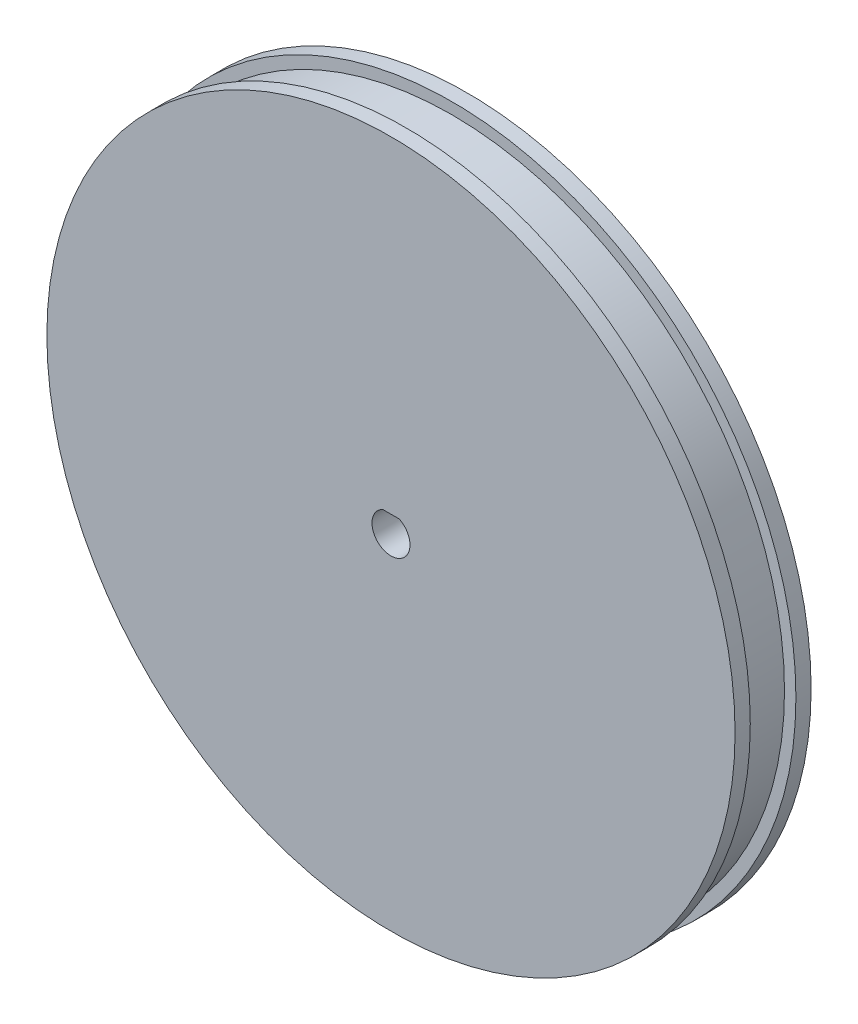
ISO-10303-21;
HEADER;
FILE_DESCRIPTION(('STEP AP214'),'2;1');
FILE_NAME('part.step','',(''),(''),'','','');
FILE_SCHEMA(('AUTOMOTIVE_DESIGN { 1 0 10303 214 1 1 1 1 }'));
ENDSEC;
DATA;
#1=APPLICATION_CONTEXT('core data for automotive mechanical design processes');
#2=APPLICATION_PROTOCOL_DEFINITION('international standard','automotive_design',2000,#1);
#3=PRODUCT_CONTEXT('',#1,'mechanical');
#4=PRODUCT('Part','Part','',(#3));
#5=PRODUCT_RELATED_PRODUCT_CATEGORY('part','',(#4));
#6=PRODUCT_DEFINITION_FORMATION('','',#4);
#7=PRODUCT_DEFINITION_CONTEXT('part definition',#1,'design');
#8=PRODUCT_DEFINITION('design','',#6,#7);
#9=PRODUCT_DEFINITION_SHAPE('','',#8);
#10=(LENGTH_UNIT() NAMED_UNIT(*) SI_UNIT(.MILLI.,.METRE.));
#11=(NAMED_UNIT(*) PLANE_ANGLE_UNIT() SI_UNIT($,.RADIAN.));
#12=(NAMED_UNIT(*) SI_UNIT($,.STERADIAN.) SOLID_ANGLE_UNIT());
#13=UNCERTAINTY_MEASURE_WITH_UNIT(LENGTH_MEASURE(1.E-05),#10,'distance_accuracy_value','');
#14=(GEOMETRIC_REPRESENTATION_CONTEXT(3) GLOBAL_UNCERTAINTY_ASSIGNED_CONTEXT((#13)) GLOBAL_UNIT_ASSIGNED_CONTEXT((#10,
#11,#12)) REPRESENTATION_CONTEXT('',''));
#15=CARTESIAN_POINT('',(0.,0.,0.));
#16=DIRECTION('',(0.,0.,1.));
#17=DIRECTION('',(1.,0.,0.));
#18=AXIS2_PLACEMENT_3D('',#15,#16,#17);
#19=CARTESIAN_POINT('',(0.,0.,6.));
#20=DIRECTION('',(0.,0.,-1.));
#21=DIRECTION('',(-1.,0.,0.));
#22=AXIS2_PLACEMENT_3D('',#19,#20,#21);
#23=CYLINDRICAL_SURFACE('',#22,43.75);
#24=CARTESIAN_POINT('',(0.,0.,6.));
#25=DIRECTION('',(0.,0.,1.));
#26=DIRECTION('',(1.,0.,0.));
#27=AXIS2_PLACEMENT_3D('',#24,#25,#26);
#28=CIRCLE('',#27,43.75);
#29=CARTESIAN_POINT('',(43.75,0.,6.));
#30=VERTEX_POINT('',#29);
#31=EDGE_CURVE('E11',#30,#30,#28,.T.);
#32=ORIENTED_EDGE('',*,*,#31,.F.);
#33=EDGE_LOOP('',(#32));
#34=FACE_BOUND('',#33,.T.);
#35=CARTESIAN_POINT('',(0.,0.,0.));
#36=DIRECTION('',(0.,0.,1.));
#37=DIRECTION('',(1.,0.,0.));
#38=AXIS2_PLACEMENT_3D('',#35,#36,#37);
#39=CIRCLE('',#38,43.75);
#40=CARTESIAN_POINT('',(43.75,0.,0.));
#41=VERTEX_POINT('',#40);
#42=EDGE_CURVE('E41',#41,#41,#39,.T.);
#43=ORIENTED_EDGE('',*,*,#42,.T.);
#44=EDGE_LOOP('',(#43));
#45=FACE_BOUND('',#44,.T.);
#46=ADVANCED_FACE('F38',(#34,#45),#23,.T.);
#47=CARTESIAN_POINT('',(0.,0.,-2.));
#48=DIRECTION('',(0.,0.,1.));
#49=DIRECTION('',(1.,0.,0.));
#50=AXIS2_PLACEMENT_3D('',#47,#48,#49);
#51=CYLINDRICAL_SURFACE('',#50,45.25);
#52=CARTESIAN_POINT('',(0.,0.,-2.));
#53=DIRECTION('',(0.,0.,-1.));
#54=DIRECTION('',(-1.,0.,0.));
#55=AXIS2_PLACEMENT_3D('',#52,#53,#54);
#56=CIRCLE('',#55,45.25);
#57=CARTESIAN_POINT('',(-45.25,0.,-2.));
#58=VERTEX_POINT('',#57);
#59=EDGE_CURVE('E93',#58,#58,#56,.T.);
#60=ORIENTED_EDGE('',*,*,#59,.F.);
#61=EDGE_LOOP('',(#60));
#62=FACE_BOUND('',#61,.T.);
#63=CARTESIAN_POINT('',(0.,0.,0.));
#64=DIRECTION('',(0.,0.,-1.));
#65=DIRECTION('',(-1.,0.,0.));
#66=AXIS2_PLACEMENT_3D('',#63,#64,#65);
#67=CIRCLE('',#66,45.25);
#68=CARTESIAN_POINT('',(-45.25,0.,0.));
#69=VERTEX_POINT('',#68);
#70=EDGE_CURVE('E89',#69,#69,#67,.T.);
#71=ORIENTED_EDGE('',*,*,#70,.T.);
#72=EDGE_LOOP('',(#71));
#73=FACE_BOUND('',#72,.T.);
#74=ADVANCED_FACE('F102',(#62,#73),#51,.T.);
#75=CARTESIAN_POINT('',(0.,0.,-2.));
#76=DIRECTION('',(0.,0.,-1.));
#77=DIRECTION('',(-1.,0.,0.));
#78=AXIS2_PLACEMENT_3D('',#75,#76,#77);
#79=PLANE('',#78);
#80=CARTESIAN_POINT('',(0.,0.,-2.));
#81=DIRECTION('',(0.,0.,1.));
#82=DIRECTION('',(1.,0.,0.));
#83=AXIS2_PLACEMENT_3D('',#80,#81,#82);
#84=CIRCLE('',#83,2.5);
#85=CARTESIAN_POINT('',(-1.08972473588517,2.25,-2.));
#86=VERTEX_POINT('',#85);
#87=CARTESIAN_POINT('',(1.08972473588517,2.25,-2.));
#88=VERTEX_POINT('',#87);
#89=EDGE_CURVE('E53',#86,#88,#84,.T.);
#90=ORIENTED_EDGE('',*,*,#89,.T.);
#91=DIRECTION('',(-1.,0.,0.));
#92=VECTOR('',#91,1.);
#93=CARTESIAN_POINT('',(-1.08972473588517,2.25,-2.));
#94=LINE('',#93,#92);
#95=EDGE_CURVE('E81',#88,#86,#94,.T.);
#96=ORIENTED_EDGE('',*,*,#95,.T.);
#97=EDGE_LOOP('',(#90,#96));
#98=FACE_BOUND('',#97,.T.);
#99=ORIENTED_EDGE('',*,*,#59,.T.);
#100=EDGE_LOOP('',(#99));
#101=FACE_BOUND('',#100,.T.);
#102=ADVANCED_FACE('F107',(#98,#101),#79,.T.);
#103=CARTESIAN_POINT('',(0.,0.,0.));
#104=DIRECTION('',(0.,0.,-1.));
#105=DIRECTION('',(-1.,0.,0.));
#106=AXIS2_PLACEMENT_3D('',#103,#104,#105);
#107=PLANE('',#106);
#108=ORIENTED_EDGE('',*,*,#42,.F.);
#109=EDGE_LOOP('',(#108));
#110=FACE_BOUND('',#109,.T.);
#111=ORIENTED_EDGE('',*,*,#70,.F.);
#112=EDGE_LOOP('',(#111));
#113=FACE_BOUND('',#112,.T.);
#114=ADVANCED_FACE('F104',(#110,#113),#107,.F.);
#115=CARTESIAN_POINT('',(0.,0.,8.));
#116=DIRECTION('',(0.,0.,-1.));
#117=DIRECTION('',(-1.,0.,0.));
#118=AXIS2_PLACEMENT_3D('',#115,#116,#117);
#119=CYLINDRICAL_SURFACE('',#118,45.25);
#120=CARTESIAN_POINT('',(0.,0.,8.));
#121=DIRECTION('',(0.,0.,1.));
#122=DIRECTION('',(1.,0.,0.));
#123=AXIS2_PLACEMENT_3D('',#120,#121,#122);
#124=CIRCLE('',#123,45.25);
#125=CARTESIAN_POINT('',(45.25,0.,8.));
#126=VERTEX_POINT('',#125);
#127=EDGE_CURVE('E85',#126,#126,#124,.T.);
#128=ORIENTED_EDGE('',*,*,#127,.F.);
#129=EDGE_LOOP('',(#128));
#130=FACE_BOUND('',#129,.T.);
#131=CARTESIAN_POINT('',(0.,0.,6.));
#132=DIRECTION('',(0.,0.,1.));
#133=DIRECTION('',(1.,0.,0.));
#134=AXIS2_PLACEMENT_3D('',#131,#132,#133);
#135=CIRCLE('',#134,45.25);
#136=CARTESIAN_POINT('',(45.25,0.,6.));
#137=VERTEX_POINT('',#136);
#138=EDGE_CURVE('E69',#137,#137,#135,.T.);
#139=ORIENTED_EDGE('',*,*,#138,.T.);
#140=EDGE_LOOP('',(#139));
#141=FACE_BOUND('',#140,.T.);
#142=ADVANCED_FACE('F106',(#130,#141),#119,.T.);
#143=CARTESIAN_POINT('',(0.,0.,8.));
#144=DIRECTION('',(0.,0.,1.));
#145=DIRECTION('',(1.,0.,0.));
#146=AXIS2_PLACEMENT_3D('',#143,#144,#145);
#147=PLANE('',#146);
#148=CARTESIAN_POINT('',(0.,0.,8.));
#149=DIRECTION('',(0.,0.,1.));
#150=DIRECTION('',(1.,0.,0.));
#151=AXIS2_PLACEMENT_3D('',#148,#149,#150);
#152=CIRCLE('',#151,2.5);
#153=CARTESIAN_POINT('',(-1.08972473588517,2.25,8.));
#154=VERTEX_POINT('',#153);
#155=CARTESIAN_POINT('',(1.08972473588517,2.25,8.));
#156=VERTEX_POINT('',#155);
#157=EDGE_CURVE('E58',#154,#156,#152,.T.);
#158=ORIENTED_EDGE('',*,*,#157,.F.);
#159=DIRECTION('',(-1.,0.,0.));
#160=VECTOR('',#159,1.);
#161=CARTESIAN_POINT('',(-1.08972473588517,2.25,8.));
#162=LINE('',#161,#160);
#163=EDGE_CURVE('E73',#156,#154,#162,.T.);
#164=ORIENTED_EDGE('',*,*,#163,.F.);
#165=EDGE_LOOP('',(#158,#164));
#166=FACE_BOUND('',#165,.T.);
#167=ORIENTED_EDGE('',*,*,#127,.T.);
#168=EDGE_LOOP('',(#167));
#169=FACE_BOUND('',#168,.T.);
#170=ADVANCED_FACE('F77',(#166,#169),#147,.T.);
#171=CARTESIAN_POINT('',(0.,0.,6.));
#172=DIRECTION('',(0.,0.,1.));
#173=DIRECTION('',(1.,0.,0.));
#174=AXIS2_PLACEMENT_3D('',#171,#172,#173);
#175=PLANE('',#174);
#176=ORIENTED_EDGE('',*,*,#31,.T.);
#177=EDGE_LOOP('',(#176));
#178=FACE_BOUND('',#177,.T.);
#179=ORIENTED_EDGE('',*,*,#138,.F.);
#180=EDGE_LOOP('',(#179));
#181=FACE_BOUND('',#180,.T.);
#182=ADVANCED_FACE('F131',(#178,#181),#175,.F.);
#183=CARTESIAN_POINT('',(0.,0.,-2.));
#184=DIRECTION('',(0.,0.,1.));
#185=DIRECTION('',(1.,0.,0.));
#186=AXIS2_PLACEMENT_3D('',#183,#184,#185);
#187=CYLINDRICAL_SURFACE('',#186,2.5);
#188=ORIENTED_EDGE('',*,*,#157,.T.);
#189=DIRECTION('',(0.,0.,1.));
#190=VECTOR('',#189,1.);
#191=CARTESIAN_POINT('',(1.08972473588517,2.25,-2.));
#192=LINE('',#191,#190);
#193=EDGE_CURVE('E70',#88,#156,#192,.T.);
#194=ORIENTED_EDGE('',*,*,#193,.F.);
#195=ORIENTED_EDGE('',*,*,#89,.F.);
#196=DIRECTION('',(0.,0.,1.));
#197=VECTOR('',#196,1.);
#198=CARTESIAN_POINT('',(-1.08972473588517,2.25,-2.));
#199=LINE('',#198,#197);
#200=EDGE_CURVE('E63',#86,#154,#199,.T.);
#201=ORIENTED_EDGE('',*,*,#200,.T.);
#202=EDGE_LOOP('',(#188,#194,#195,#201));
#203=FACE_BOUND('',#202,.T.);
#204=ADVANCED_FACE('F65',(#203),#187,.F.);
#205=CARTESIAN_POINT('',(-1.08972473588517,2.25,-2.));
#206=DIRECTION('',(0.,1.,0.));
#207=DIRECTION('',(0.,0.,1.));
#208=AXIS2_PLACEMENT_3D('',#205,#206,#207);
#209=PLANE('',#208);
#210=ORIENTED_EDGE('',*,*,#163,.T.);
#211=ORIENTED_EDGE('',*,*,#200,.F.);
#212=ORIENTED_EDGE('',*,*,#95,.F.);
#213=ORIENTED_EDGE('',*,*,#193,.T.);
#214=EDGE_LOOP('',(#210,#211,#212,#213));
#215=FACE_BOUND('',#214,.T.);
#216=ADVANCED_FACE('F74',(#215),#209,.F.);
#217=CLOSED_SHELL('',(#46,#74,#102,#114,#142,#170,#182,#204,#216));
#218=MANIFOLD_SOLID_BREP('B2',#217);
#219=ADVANCED_BREP_SHAPE_REPRESENTATION('',(#18,#218),#14);
#220=SHAPE_DEFINITION_REPRESENTATION(#9,#219);
ENDSEC;
END-ISO-10303-21;
